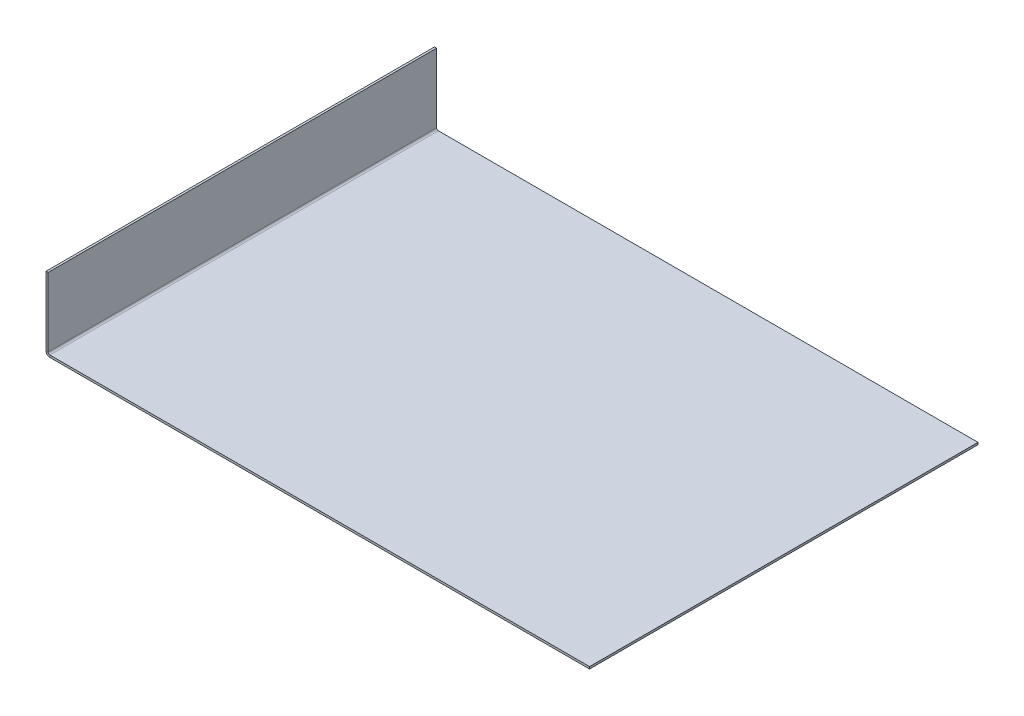
ISO-10303-21;
HEADER;
FILE_DESCRIPTION(('STEP AP214'),'2;1');
FILE_NAME('part.step','',(''),(''),'','','');
FILE_SCHEMA(('AUTOMOTIVE_DESIGN { 1 0 10303 214 1 1 1 1 }'));
ENDSEC;
DATA;
#1=APPLICATION_CONTEXT('core data for automotive mechanical design processes');
#2=APPLICATION_PROTOCOL_DEFINITION('international standard','automotive_design',2000,#1);
#3=PRODUCT_CONTEXT('',#1,'mechanical');
#4=PRODUCT('Part','Part','',(#3));
#5=PRODUCT_RELATED_PRODUCT_CATEGORY('part','',(#4));
#6=PRODUCT_DEFINITION_FORMATION('','',#4);
#7=PRODUCT_DEFINITION_CONTEXT('part definition',#1,'design');
#8=PRODUCT_DEFINITION('design','',#6,#7);
#9=PRODUCT_DEFINITION_SHAPE('','',#8);
#10=(LENGTH_UNIT() NAMED_UNIT(*) SI_UNIT(.MILLI.,.METRE.));
#11=(NAMED_UNIT(*) PLANE_ANGLE_UNIT() SI_UNIT($,.RADIAN.));
#12=(NAMED_UNIT(*) SI_UNIT($,.STERADIAN.) SOLID_ANGLE_UNIT());
#13=UNCERTAINTY_MEASURE_WITH_UNIT(LENGTH_MEASURE(1.E-05),#10,'distance_accuracy_value','');
#14=(GEOMETRIC_REPRESENTATION_CONTEXT(3) GLOBAL_UNCERTAINTY_ASSIGNED_CONTEXT((#13)) GLOBAL_UNIT_ASSIGNED_CONTEXT((#10,
#11,#12)) REPRESENTATION_CONTEXT('',''));
#15=CARTESIAN_POINT('',(0.,0.,0.));
#16=DIRECTION('',(0.,0.,1.));
#17=DIRECTION('',(1.,0.,0.));
#18=AXIS2_PLACEMENT_3D('',#15,#16,#17);
#19=CARTESIAN_POINT('',(220.14979683455,30.,-82.5));
#20=DIRECTION('',(0.,0.,-1.));
#21=DIRECTION('',(0.,1.,0.));
#22=AXIS2_PLACEMENT_3D('',#19,#20,#21);
#23=PLANE('',#22);
#24=DIRECTION('',(0.,-1.,0.));
#25=VECTOR('',#24,1.);
#26=CARTESIAN_POINT('',(-115.9,30.,-82.5));
#27=LINE('',#26,#25);
#28=CARTESIAN_POINT('',(-115.9,30.,-82.5));
#29=VERTEX_POINT('',#28);
#30=CARTESIAN_POINT('',(-115.9,0.736599999999979,-82.5));
#31=VERTEX_POINT('',#30);
#32=EDGE_CURVE('E167',#29,#31,#27,.T.);
#33=ORIENTED_EDGE('',*,*,#32,.F.);
#34=DIRECTION('',(-1.,0.,0.));
#35=VECTOR('',#34,1.);
#36=CARTESIAN_POINT('',(220.14979683455,30.,-82.5));
#37=LINE('',#36,#35);
#38=CARTESIAN_POINT('',(-115.,30.,-82.5));
#39=VERTEX_POINT('',#38);
#40=EDGE_CURVE('E45',#39,#29,#37,.T.);
#41=ORIENTED_EDGE('',*,*,#40,.F.);
#42=DIRECTION('',(0.,-1.,0.));
#43=VECTOR('',#42,1.);
#44=CARTESIAN_POINT('',(-115.,30.,-82.5));
#45=LINE('',#44,#43);
#46=CARTESIAN_POINT('',(-115.,0.736599999999991,-82.5));
#47=VERTEX_POINT('',#46);
#48=EDGE_CURVE('E170',#39,#47,#45,.T.);
#49=ORIENTED_EDGE('',*,*,#48,.T.);
#50=DIRECTION('',(-1.,0.,0.));
#51=VECTOR('',#50,1.);
#52=CARTESIAN_POINT('',(220.14979683455,0.73659999999999,-82.5));
#53=LINE('',#52,#51);
#54=EDGE_CURVE('E11',#47,#31,#53,.T.);
#55=ORIENTED_EDGE('',*,*,#54,.T.);
#56=EDGE_LOOP('',(#33,#41,#49,#55));
#57=FACE_BOUND('',#56,.T.);
#58=ADVANCED_FACE('F38',(#57),#23,.T.);
#59=CARTESIAN_POINT('',(220.14979683455,30.,82.5));
#60=DIRECTION('',(0.,-1.,0.));
#61=DIRECTION('',(1.,0.,0.));
#62=AXIS2_PLACEMENT_3D('',#59,#60,#61);
#63=PLANE('',#62);
#64=ORIENTED_EDGE('',*,*,#40,.T.);
#65=DIRECTION('',(0.,0.,1.));
#66=VECTOR('',#65,1.);
#67=CARTESIAN_POINT('',(-115.9,30.,0.));
#68=LINE('',#67,#66);
#69=CARTESIAN_POINT('',(-115.9,30.,82.5));
#70=VERTEX_POINT('',#69);
#71=EDGE_CURVE('E164',#29,#70,#68,.T.);
#72=ORIENTED_EDGE('',*,*,#71,.T.);
#73=DIRECTION('',(-1.,0.,0.));
#74=VECTOR('',#73,1.);
#75=CARTESIAN_POINT('',(220.14979683455,30.,82.5));
#76=LINE('',#75,#74);
#77=CARTESIAN_POINT('',(-115.,30.,82.5));
#78=VERTEX_POINT('',#77);
#79=EDGE_CURVE('E180',#78,#70,#76,.T.);
#80=ORIENTED_EDGE('',*,*,#79,.F.);
#81=DIRECTION('',(0.,0.,1.));
#82=VECTOR('',#81,1.);
#83=CARTESIAN_POINT('',(-115.,30.,82.5));
#84=LINE('',#83,#82);
#85=EDGE_CURVE('E52',#39,#78,#84,.T.);
#86=ORIENTED_EDGE('',*,*,#85,.F.);
#87=EDGE_LOOP('',(#64,#72,#80,#86));
#88=FACE_BOUND('',#87,.T.);
#89=ADVANCED_FACE('F181',(#88),#63,.F.);
#90=CARTESIAN_POINT('',(220.14979683455,30.,82.5));
#91=DIRECTION('',(0.,0.,-1.));
#92=DIRECTION('',(0.,1.,0.));
#93=AXIS2_PLACEMENT_3D('',#90,#91,#92);
#94=PLANE('',#93);
#95=ORIENTED_EDGE('',*,*,#79,.T.);
#96=DIRECTION('',(0.,-1.,0.));
#97=VECTOR('',#96,1.);
#98=CARTESIAN_POINT('',(-115.9,30.,82.5));
#99=LINE('',#98,#97);
#100=CARTESIAN_POINT('',(-115.9,0.736600000000004,82.5));
#101=VERTEX_POINT('',#100);
#102=EDGE_CURVE('E144',#70,#101,#99,.T.);
#103=ORIENTED_EDGE('',*,*,#102,.T.);
#104=DIRECTION('',(-1.,0.,0.));
#105=VECTOR('',#104,1.);
#106=CARTESIAN_POINT('',(220.14979683455,0.73659999999999,82.5));
#107=LINE('',#106,#105);
#108=CARTESIAN_POINT('',(-115.,0.736599999999981,82.5));
#109=VERTEX_POINT('',#108);
#110=EDGE_CURVE('E177',#109,#101,#107,.T.);
#111=ORIENTED_EDGE('',*,*,#110,.F.);
#112=DIRECTION('',(0.,-1.,0.));
#113=VECTOR('',#112,1.);
#114=CARTESIAN_POINT('',(-115.,30.,82.5));
#115=LINE('',#114,#113);
#116=EDGE_CURVE('E60',#78,#109,#115,.T.);
#117=ORIENTED_EDGE('',*,*,#116,.F.);
#118=EDGE_LOOP('',(#95,#103,#111,#117));
#119=FACE_BOUND('',#118,.T.);
#120=ADVANCED_FACE('F195',(#119),#94,.F.);
#121=CARTESIAN_POINT('',(-115.,30.,82.5));
#122=DIRECTION('',(1.,0.,0.));
#123=DIRECTION('',(0.,0.,-1.));
#124=AXIS2_PLACEMENT_3D('',#121,#122,#123);
#125=PLANE('',#124);
#126=DIRECTION('',(0.,0.,1.));
#127=VECTOR('',#126,1.);
#128=CARTESIAN_POINT('',(-115.,0.73659999999999,-82.5));
#129=LINE('',#128,#127);
#130=EDGE_CURVE('E175',#47,#109,#129,.T.);
#131=ORIENTED_EDGE('',*,*,#130,.F.);
#132=ORIENTED_EDGE('',*,*,#48,.F.);
#133=ORIENTED_EDGE('',*,*,#85,.T.);
#134=ORIENTED_EDGE('',*,*,#116,.T.);
#135=EDGE_LOOP('',(#131,#132,#133,#134));
#136=FACE_BOUND('',#135,.T.);
#137=ADVANCED_FACE('F187',(#136),#125,.T.);
#138=CARTESIAN_POINT('',(-115.9,30.,82.5));
#139=DIRECTION('',(1.,0.,0.));
#140=DIRECTION('',(0.,0.,-1.));
#141=AXIS2_PLACEMENT_3D('',#138,#139,#140);
#142=PLANE('',#141);
#143=ORIENTED_EDGE('',*,*,#32,.T.);
#144=DIRECTION('',(0.,0.,1.));
#145=VECTOR('',#144,1.);
#146=CARTESIAN_POINT('',(-115.9,0.73659999999999,-82.5));
#147=LINE('',#146,#145);
#148=EDGE_CURVE('E125',#31,#101,#147,.T.);
#149=ORIENTED_EDGE('',*,*,#148,.T.);
#150=ORIENTED_EDGE('',*,*,#102,.F.);
#151=ORIENTED_EDGE('',*,*,#71,.F.);
#152=EDGE_LOOP('',(#143,#149,#150,#151));
#153=FACE_BOUND('',#152,.T.);
#154=ADVANCED_FACE('F197',(#153),#142,.F.);
#155=CARTESIAN_POINT('',(115.,564.93081551482,82.5));
#156=DIRECTION('',(-1.,0.,0.));
#157=DIRECTION('',(0.,0.,1.));
#158=AXIS2_PLACEMENT_3D('',#155,#156,#157);
#159=PLANE('',#158);
#160=DIRECTION('',(0.,0.,-1.));
#161=VECTOR('',#160,1.);
#162=CARTESIAN_POINT('',(115.,-0.9,0.));
#163=LINE('',#162,#161);
#164=CARTESIAN_POINT('',(115.,-0.900000000000001,82.5));
#165=VERTEX_POINT('',#164);
#166=CARTESIAN_POINT('',(115.,-0.900000000000012,-82.5));
#167=VERTEX_POINT('',#166);
#168=EDGE_CURVE('E116',#165,#167,#163,.T.);
#169=ORIENTED_EDGE('',*,*,#168,.T.);
#170=DIRECTION('',(0.,-1.,0.));
#171=VECTOR('',#170,1.);
#172=CARTESIAN_POINT('',(115.,564.93081551482,-82.5));
#173=LINE('',#172,#171);
#174=CARTESIAN_POINT('',(115.,0.,-82.5));
#175=VERTEX_POINT('',#174);
#176=EDGE_CURVE('E142',#175,#167,#173,.T.);
#177=ORIENTED_EDGE('',*,*,#176,.F.);
#178=DIRECTION('',(0.,0.,-1.));
#179=VECTOR('',#178,1.);
#180=CARTESIAN_POINT('',(115.,0.,82.5));
#181=LINE('',#180,#179);
#182=CARTESIAN_POINT('',(115.,0.,82.5));
#183=VERTEX_POINT('',#182);
#184=EDGE_CURVE('E154',#183,#175,#181,.T.);
#185=ORIENTED_EDGE('',*,*,#184,.F.);
#186=DIRECTION('',(0.,-1.,0.));
#187=VECTOR('',#186,1.);
#188=CARTESIAN_POINT('',(115.,564.93081551482,82.5));
#189=LINE('',#188,#187);
#190=EDGE_CURVE('E158',#183,#165,#189,.T.);
#191=ORIENTED_EDGE('',*,*,#190,.T.);
#192=EDGE_LOOP('',(#169,#177,#185,#191));
#193=FACE_BOUND('',#192,.T.);
#194=ADVANCED_FACE('F199',(#193),#159,.F.);
#195=CARTESIAN_POINT('',(0.,0.,0.));
#196=DIRECTION('',(0.,-1.,0.));
#197=DIRECTION('',(0.,0.,-1.));
#198=AXIS2_PLACEMENT_3D('',#195,#196,#197);
#199=PLANE('',#198);
#200=DIRECTION('',(0.,0.,-1.));
#201=VECTOR('',#200,1.);
#202=CARTESIAN_POINT('',(-114.2634,0.,-82.5));
#203=LINE('',#202,#201);
#204=CARTESIAN_POINT('',(-114.2634,0.,82.5));
#205=VERTEX_POINT('',#204);
#206=CARTESIAN_POINT('',(-114.2634,0.,-82.5));
#207=VERTEX_POINT('',#206);
#208=EDGE_CURVE('E117',#205,#207,#203,.T.);
#209=ORIENTED_EDGE('',*,*,#208,.F.);
#210=DIRECTION('',(1.,0.,0.));
#211=VECTOR('',#210,1.);
#212=CARTESIAN_POINT('',(-115.,0.,82.5));
#213=LINE('',#212,#211);
#214=EDGE_CURVE('E156',#205,#183,#213,.T.);
#215=ORIENTED_EDGE('',*,*,#214,.T.);
#216=ORIENTED_EDGE('',*,*,#184,.T.);
#217=DIRECTION('',(-1.,0.,0.));
#218=VECTOR('',#217,1.);
#219=CARTESIAN_POINT('',(-115.,0.,-82.5));
#220=LINE('',#219,#218);
#221=EDGE_CURVE('E151',#175,#207,#220,.T.);
#222=ORIENTED_EDGE('',*,*,#221,.T.);
#223=EDGE_LOOP('',(#209,#215,#216,#222));
#224=FACE_BOUND('',#223,.T.);
#225=ADVANCED_FACE('F205',(#224),#199,.F.);
#226=CARTESIAN_POINT('',(-115.,564.93081551482,82.5));
#227=DIRECTION('',(0.,0.,-1.));
#228=DIRECTION('',(-1.,0.,0.));
#229=AXIS2_PLACEMENT_3D('',#226,#227,#228);
#230=PLANE('',#229);
#231=DIRECTION('',(1.,0.,0.));
#232=VECTOR('',#231,1.);
#233=CARTESIAN_POINT('',(0.,-0.9,82.5));
#234=LINE('',#233,#232);
#235=CARTESIAN_POINT('',(-114.2634,-0.900000000000012,82.5));
#236=VERTEX_POINT('',#235);
#237=EDGE_CURVE('E136',#236,#165,#234,.T.);
#238=ORIENTED_EDGE('',*,*,#237,.T.);
#239=ORIENTED_EDGE('',*,*,#190,.F.);
#240=ORIENTED_EDGE('',*,*,#214,.F.);
#241=DIRECTION('',(0.,-1.,0.));
#242=VECTOR('',#241,1.);
#243=CARTESIAN_POINT('',(-114.2634,564.93081551482,82.5));
#244=LINE('',#243,#242);
#245=EDGE_CURVE('E137',#205,#236,#244,.T.);
#246=ORIENTED_EDGE('',*,*,#245,.T.);
#247=EDGE_LOOP('',(#238,#239,#240,#246));
#248=FACE_BOUND('',#247,.T.);
#249=ADVANCED_FACE('F246',(#248),#230,.F.);
#250=CARTESIAN_POINT('',(0.,-0.9,0.));
#251=DIRECTION('',(0.,-1.,0.));
#252=DIRECTION('',(0.,0.,-1.));
#253=AXIS2_PLACEMENT_3D('',#250,#251,#252);
#254=PLANE('',#253);
#255=ORIENTED_EDGE('',*,*,#237,.F.);
#256=DIRECTION('',(0.,0.,-1.));
#257=VECTOR('',#256,1.);
#258=CARTESIAN_POINT('',(-114.2634,-0.900000000000012,-82.5));
#259=LINE('',#258,#257);
#260=CARTESIAN_POINT('',(-114.2634,-0.9,-82.5));
#261=VERTEX_POINT('',#260);
#262=EDGE_CURVE('E122',#236,#261,#259,.T.);
#263=ORIENTED_EDGE('',*,*,#262,.T.);
#264=DIRECTION('',(-1.,0.,0.));
#265=VECTOR('',#264,1.);
#266=CARTESIAN_POINT('',(0.,-0.9,-82.5));
#267=LINE('',#266,#265);
#268=EDGE_CURVE('E134',#167,#261,#267,.T.);
#269=ORIENTED_EDGE('',*,*,#268,.F.);
#270=ORIENTED_EDGE('',*,*,#168,.F.);
#271=EDGE_LOOP('',(#255,#263,#269,#270));
#272=FACE_BOUND('',#271,.T.);
#273=ADVANCED_FACE('F132',(#272),#254,.T.);
#274=CARTESIAN_POINT('',(-115.,564.93081551482,-82.5));
#275=DIRECTION('',(0.,0.,1.));
#276=DIRECTION('',(1.,0.,0.));
#277=AXIS2_PLACEMENT_3D('',#274,#275,#276);
#278=PLANE('',#277);
#279=ORIENTED_EDGE('',*,*,#268,.T.);
#280=DIRECTION('',(0.,-1.,0.));
#281=VECTOR('',#280,1.);
#282=CARTESIAN_POINT('',(-114.2634,564.93081551482,-82.5));
#283=LINE('',#282,#281);
#284=EDGE_CURVE('E105',#207,#261,#283,.T.);
#285=ORIENTED_EDGE('',*,*,#284,.F.);
#286=ORIENTED_EDGE('',*,*,#221,.F.);
#287=ORIENTED_EDGE('',*,*,#176,.T.);
#288=EDGE_LOOP('',(#279,#285,#286,#287));
#289=FACE_BOUND('',#288,.T.);
#290=ADVANCED_FACE('F140',(#289),#278,.F.);
#291=CARTESIAN_POINT('',(-114.2634,0.7366,-82.5));
#292=DIRECTION('',(0.,0.,-1.));
#293=DIRECTION('',(-1.,0.,0.));
#294=AXIS2_PLACEMENT_3D('',#291,#292,#293);
#295=PLANE('',#294);
#296=ORIENTED_EDGE('',*,*,#54,.F.);
#297=CARTESIAN_POINT('',(-114.2634,0.7366,-82.5));
#298=DIRECTION('',(0.,0.,1.));
#299=DIRECTION('',(1.,0.,0.));
#300=AXIS2_PLACEMENT_3D('',#297,#298,#299);
#301=CIRCLE('',#300,0.7366);
#302=EDGE_CURVE('E111',#47,#207,#301,.T.);
#303=ORIENTED_EDGE('',*,*,#302,.T.);
#304=ORIENTED_EDGE('',*,*,#284,.T.);
#305=CARTESIAN_POINT('',(-114.2634,0.7366,-82.5));
#306=DIRECTION('',(0.,0.,1.));
#307=DIRECTION('',(1.,0.,0.));
#308=AXIS2_PLACEMENT_3D('',#305,#306,#307);
#309=CIRCLE('',#308,1.6366);
#310=EDGE_CURVE('E108',#31,#261,#309,.T.);
#311=ORIENTED_EDGE('',*,*,#310,.F.);
#312=EDGE_LOOP('',(#296,#303,#304,#311));
#313=FACE_BOUND('',#312,.T.);
#314=ADVANCED_FACE('F107',(#313),#295,.T.);
#315=CARTESIAN_POINT('',(-114.2634,0.7366,82.5));
#316=DIRECTION('',(0.,0.,1.));
#317=DIRECTION('',(1.,0.,0.));
#318=AXIS2_PLACEMENT_3D('',#315,#316,#317);
#319=PLANE('',#318);
#320=CARTESIAN_POINT('',(-114.2634,0.7366,82.5));
#321=DIRECTION('',(0.,0.,1.));
#322=DIRECTION('',(1.,0.,0.));
#323=AXIS2_PLACEMENT_3D('',#320,#321,#322);
#324=CIRCLE('',#323,0.7366);
#325=EDGE_CURVE('E127',#205,#109,#324,.F.);
#326=ORIENTED_EDGE('',*,*,#325,.T.);
#327=ORIENTED_EDGE('',*,*,#110,.T.);
#328=CARTESIAN_POINT('',(-114.2634,0.7366,82.5));
#329=DIRECTION('',(0.,0.,1.));
#330=DIRECTION('',(1.,0.,0.));
#331=AXIS2_PLACEMENT_3D('',#328,#329,#330);
#332=CIRCLE('',#331,1.6366);
#333=EDGE_CURVE('E126',#236,#101,#332,.F.);
#334=ORIENTED_EDGE('',*,*,#333,.F.);
#335=ORIENTED_EDGE('',*,*,#245,.F.);
#336=EDGE_LOOP('',(#326,#327,#334,#335));
#337=FACE_BOUND('',#336,.T.);
#338=ADVANCED_FACE('F194',(#337),#319,.T.);
#339=CARTESIAN_POINT('',(-114.2634,0.7366,-390.767952033638));
#340=DIRECTION('',(0.,0.,1.));
#341=DIRECTION('',(1.,0.,0.));
#342=AXIS2_PLACEMENT_3D('',#339,#340,#341);
#343=CYLINDRICAL_SURFACE('',#342,1.6366);
#344=ORIENTED_EDGE('',*,*,#262,.F.);
#345=ORIENTED_EDGE('',*,*,#333,.T.);
#346=ORIENTED_EDGE('',*,*,#148,.F.);
#347=ORIENTED_EDGE('',*,*,#310,.T.);
#348=EDGE_LOOP('',(#344,#345,#346,#347));
#349=FACE_BOUND('',#348,.T.);
#350=ADVANCED_FACE('F121',(#349),#343,.T.);
#351=CARTESIAN_POINT('',(-114.2634,0.7366,-390.767952033638));
#352=DIRECTION('',(0.,0.,1.));
#353=DIRECTION('',(1.,0.,0.));
#354=AXIS2_PLACEMENT_3D('',#351,#352,#353);
#355=CYLINDRICAL_SURFACE('',#354,0.7366);
#356=ORIENTED_EDGE('',*,*,#208,.T.);
#357=ORIENTED_EDGE('',*,*,#302,.F.);
#358=ORIENTED_EDGE('',*,*,#130,.T.);
#359=ORIENTED_EDGE('',*,*,#325,.F.);
#360=EDGE_LOOP('',(#356,#357,#358,#359));
#361=FACE_BOUND('',#360,.T.);
#362=ADVANCED_FACE('F191',(#361),#355,.F.);
#363=CLOSED_SHELL('',(#58,#89,#120,#137,#154,#194,#225,#249,#273,#290,#314,#338,#350,#362));
#364=MANIFOLD_SOLID_BREP('B2',#363);
#365=ADVANCED_BREP_SHAPE_REPRESENTATION('',(#18,#364),#14);
#366=SHAPE_DEFINITION_REPRESENTATION(#9,#365);
ENDSEC;
END-ISO-10303-21;
